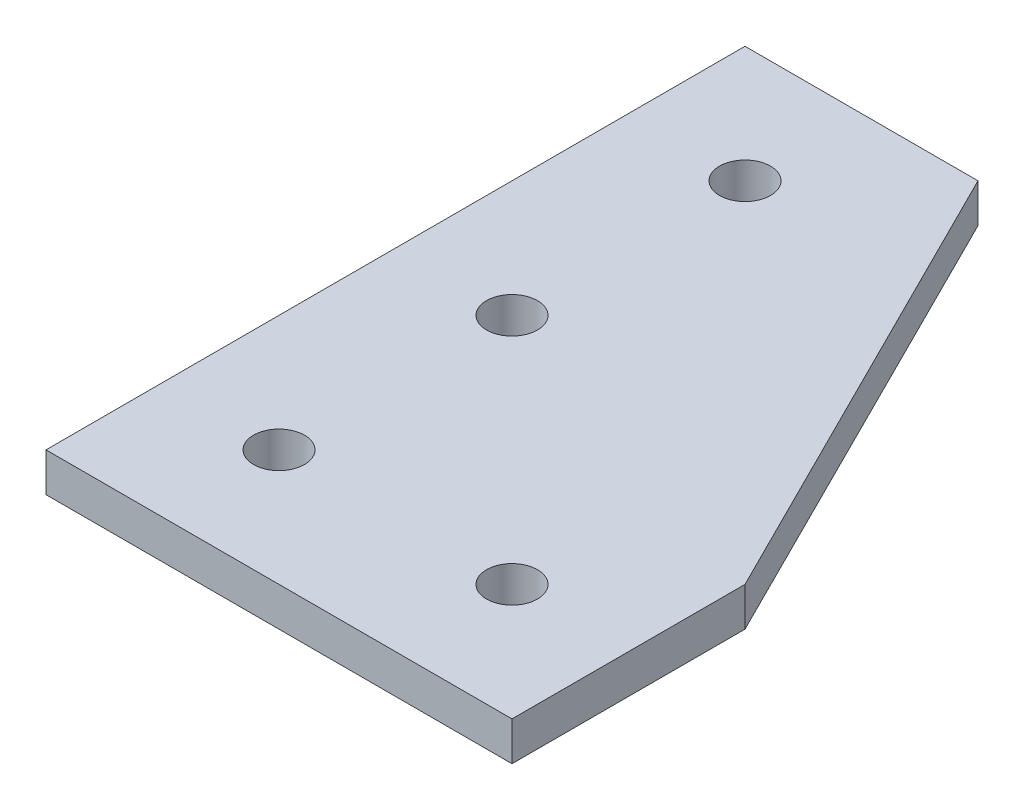
ISO-10303-21;
HEADER;
FILE_DESCRIPTION(('STEP AP214'),'2;1');
FILE_NAME('part.step','',(''),(''),'','','');
FILE_SCHEMA(('AUTOMOTIVE_DESIGN { 1 0 10303 214 1 1 1 1 }'));
ENDSEC;
DATA;
#1=APPLICATION_CONTEXT('core data for automotive mechanical design processes');
#2=APPLICATION_PROTOCOL_DEFINITION('international standard','automotive_design',2000,#1);
#3=PRODUCT_CONTEXT('',#1,'mechanical');
#4=PRODUCT('Part','Part','',(#3));
#5=PRODUCT_RELATED_PRODUCT_CATEGORY('part','',(#4));
#6=PRODUCT_DEFINITION_FORMATION('','',#4);
#7=PRODUCT_DEFINITION_CONTEXT('part definition',#1,'design');
#8=PRODUCT_DEFINITION('design','',#6,#7);
#9=PRODUCT_DEFINITION_SHAPE('','',#8);
#10=(LENGTH_UNIT() NAMED_UNIT(*) SI_UNIT(.MILLI.,.METRE.));
#11=(NAMED_UNIT(*) PLANE_ANGLE_UNIT() SI_UNIT($,.RADIAN.));
#12=(NAMED_UNIT(*) SI_UNIT($,.STERADIAN.) SOLID_ANGLE_UNIT());
#13=UNCERTAINTY_MEASURE_WITH_UNIT(LENGTH_MEASURE(1.E-05),#10,'distance_accuracy_value','');
#14=(GEOMETRIC_REPRESENTATION_CONTEXT(3) GLOBAL_UNCERTAINTY_ASSIGNED_CONTEXT((#13)) GLOBAL_UNIT_ASSIGNED_CONTEXT((#10,
#11,#12)) REPRESENTATION_CONTEXT('',''));
#15=CARTESIAN_POINT('',(0.,0.,0.));
#16=DIRECTION('',(0.,0.,1.));
#17=DIRECTION('',(1.,0.,0.));
#18=AXIS2_PLACEMENT_3D('',#15,#16,#17);
#19=CARTESIAN_POINT('',(38.1,-3.175,57.15));
#20=DIRECTION('',(-1.,0.,0.));
#21=DIRECTION('',(0.,0.,1.));
#22=AXIS2_PLACEMENT_3D('',#19,#20,#21);
#23=PLANE('',#22);
#24=DIRECTION('',(0.,0.,-1.));
#25=VECTOR('',#24,1.);
#26=CARTESIAN_POINT('',(38.1,-3.175,57.15));
#27=LINE('',#26,#25);
#28=CARTESIAN_POINT('',(38.1,-3.175,57.15));
#29=VERTEX_POINT('',#28);
#30=CARTESIAN_POINT('',(38.1,-3.175,19.05));
#31=VERTEX_POINT('',#30);
#32=EDGE_CURVE('E113',#29,#31,#27,.T.);
#33=ORIENTED_EDGE('',*,*,#32,.T.);
#34=DIRECTION('',(0.,1.,0.));
#35=VECTOR('',#34,1.);
#36=CARTESIAN_POINT('',(38.1,-4.445,19.05));
#37=LINE('',#36,#35);
#38=CARTESIAN_POINT('',(38.1,3.175,19.05));
#39=VERTEX_POINT('',#38);
#40=EDGE_CURVE('E100',#31,#39,#37,.T.);
#41=ORIENTED_EDGE('',*,*,#40,.T.);
#42=DIRECTION('',(0.,0.,-1.));
#43=VECTOR('',#42,1.);
#44=CARTESIAN_POINT('',(38.1,3.175,57.15));
#45=LINE('',#44,#43);
#46=CARTESIAN_POINT('',(38.1,3.175,57.15));
#47=VERTEX_POINT('',#46);
#48=EDGE_CURVE('E43',#47,#39,#45,.T.);
#49=ORIENTED_EDGE('',*,*,#48,.F.);
#50=DIRECTION('',(0.,1.,0.));
#51=VECTOR('',#50,1.);
#52=CARTESIAN_POINT('',(38.1,-3.175,57.15));
#53=LINE('',#52,#51);
#54=EDGE_CURVE('E112',#29,#47,#53,.T.);
#55=ORIENTED_EDGE('',*,*,#54,.F.);
#56=EDGE_LOOP('',(#33,#41,#49,#55));
#57=FACE_BOUND('',#56,.T.);
#58=ADVANCED_FACE('F36',(#57),#23,.F.);
#59=CARTESIAN_POINT('',(-38.1,3.175,57.15));
#60=DIRECTION('',(0.,-1.,0.));
#61=DIRECTION('',(0.,0.,-1.));
#62=AXIS2_PLACEMENT_3D('',#59,#60,#61);
#63=PLANE('',#62);
#64=CARTESIAN_POINT('',(-19.05,3.175,-38.1));
#65=DIRECTION('',(0.,1.,0.));
#66=DIRECTION('',(0.,0.,1.));
#67=AXIS2_PLACEMENT_3D('',#64,#65,#66);
#68=CIRCLE('',#67,4.167251);
#69=CARTESIAN_POINT('',(-19.05,3.175,-33.932749));
#70=VERTEX_POINT('',#69);
#71=EDGE_CURVE('E146',#70,#70,#68,.T.);
#72=ORIENTED_EDGE('',*,*,#71,.F.);
#73=EDGE_LOOP('',(#72));
#74=FACE_BOUND('',#73,.T.);
#75=CARTESIAN_POINT('',(-19.05,3.175,0.));
#76=DIRECTION('',(0.,1.,0.));
#77=DIRECTION('',(0.,0.,1.));
#78=AXIS2_PLACEMENT_3D('',#75,#76,#77);
#79=CIRCLE('',#78,4.167251);
#80=CARTESIAN_POINT('',(-19.05,3.175,4.16725099999999));
#81=VERTEX_POINT('',#80);
#82=EDGE_CURVE('E140',#81,#81,#79,.T.);
#83=ORIENTED_EDGE('',*,*,#82,.F.);
#84=EDGE_LOOP('',(#83));
#85=FACE_BOUND('',#84,.T.);
#86=CARTESIAN_POINT('',(19.05,3.175,38.1));
#87=DIRECTION('',(0.,1.,0.));
#88=DIRECTION('',(0.,0.,1.));
#89=AXIS2_PLACEMENT_3D('',#86,#87,#88);
#90=CIRCLE('',#89,4.167251);
#91=CARTESIAN_POINT('',(19.05,3.175,42.267251));
#92=VERTEX_POINT('',#91);
#93=EDGE_CURVE('E134',#92,#92,#90,.T.);
#94=ORIENTED_EDGE('',*,*,#93,.F.);
#95=EDGE_LOOP('',(#94));
#96=FACE_BOUND('',#95,.T.);
#97=CARTESIAN_POINT('',(-19.05,3.175,38.1));
#98=DIRECTION('',(0.,1.,0.));
#99=DIRECTION('',(0.,0.,1.));
#100=AXIS2_PLACEMENT_3D('',#97,#98,#99);
#101=CIRCLE('',#100,4.167251);
#102=CARTESIAN_POINT('',(-19.05,3.175,42.267251));
#103=VERTEX_POINT('',#102);
#104=EDGE_CURVE('E128',#103,#103,#101,.T.);
#105=ORIENTED_EDGE('',*,*,#104,.F.);
#106=EDGE_LOOP('',(#105));
#107=FACE_BOUND('',#106,.T.);
#108=ORIENTED_EDGE('',*,*,#48,.T.);
#109=DIRECTION('',(0.447213595499958,0.,0.894427190999916));
#110=VECTOR('',#109,1.);
#111=CARTESIAN_POINT('',(0.,3.175,-57.15));
#112=LINE('',#111,#110);
#113=CARTESIAN_POINT('',(0.,3.175,-57.15));
#114=VERTEX_POINT('',#113);
#115=EDGE_CURVE('E91',#114,#39,#112,.T.);
#116=ORIENTED_EDGE('',*,*,#115,.F.);
#117=DIRECTION('',(-1.,0.,0.));
#118=VECTOR('',#117,1.);
#119=CARTESIAN_POINT('',(-38.1,3.175,-57.15));
#120=LINE('',#119,#118);
#121=CARTESIAN_POINT('',(-38.1,3.175,-57.15));
#122=VERTEX_POINT('',#121);
#123=EDGE_CURVE('E98',#114,#122,#120,.T.);
#124=ORIENTED_EDGE('',*,*,#123,.T.);
#125=DIRECTION('',(0.,0.,-1.));
#126=VECTOR('',#125,1.);
#127=CARTESIAN_POINT('',(-38.1,3.175,57.15));
#128=LINE('',#127,#126);
#129=CARTESIAN_POINT('',(-38.1,3.175,57.15));
#130=VERTEX_POINT('',#129);
#131=EDGE_CURVE('E118',#130,#122,#128,.T.);
#132=ORIENTED_EDGE('',*,*,#131,.F.);
#133=DIRECTION('',(-1.,0.,0.));
#134=VECTOR('',#133,1.);
#135=CARTESIAN_POINT('',(-38.1,3.175,57.15));
#136=LINE('',#135,#134);
#137=EDGE_CURVE('E82',#47,#130,#136,.T.);
#138=ORIENTED_EDGE('',*,*,#137,.F.);
#139=EDGE_LOOP('',(#108,#116,#124,#132,#138));
#140=FACE_BOUND('',#139,.T.);
#141=ADVANCED_FACE('F97',(#74,#85,#96,#107,#140),#63,.F.);
#142=CARTESIAN_POINT('',(-38.1,-3.175,57.15));
#143=DIRECTION('',(1.,0.,0.));
#144=DIRECTION('',(0.,0.,-1.));
#145=AXIS2_PLACEMENT_3D('',#142,#143,#144);
#146=PLANE('',#145);
#147=DIRECTION('',(0.,-1.,0.));
#148=VECTOR('',#147,1.);
#149=CARTESIAN_POINT('',(-38.1,-3.175,-57.15));
#150=LINE('',#149,#148);
#151=CARTESIAN_POINT('',(-38.1,-3.175,-57.15));
#152=VERTEX_POINT('',#151);
#153=EDGE_CURVE('E74',#122,#152,#150,.T.);
#154=ORIENTED_EDGE('',*,*,#153,.T.);
#155=DIRECTION('',(0.,0.,-1.));
#156=VECTOR('',#155,1.);
#157=CARTESIAN_POINT('',(-38.1,-3.175,57.15));
#158=LINE('',#157,#156);
#159=CARTESIAN_POINT('',(-38.1,-3.175,57.15));
#160=VERTEX_POINT('',#159);
#161=EDGE_CURVE('E116',#160,#152,#158,.T.);
#162=ORIENTED_EDGE('',*,*,#161,.F.);
#163=DIRECTION('',(0.,-1.,0.));
#164=VECTOR('',#163,1.);
#165=CARTESIAN_POINT('',(-38.1,-3.175,57.15));
#166=LINE('',#165,#164);
#167=EDGE_CURVE('E121',#130,#160,#166,.T.);
#168=ORIENTED_EDGE('',*,*,#167,.F.);
#169=ORIENTED_EDGE('',*,*,#131,.T.);
#170=EDGE_LOOP('',(#154,#162,#168,#169));
#171=FACE_BOUND('',#170,.T.);
#172=ADVANCED_FACE('F120',(#171),#146,.F.);
#173=CARTESIAN_POINT('',(-38.1,-3.175,57.15));
#174=DIRECTION('',(0.,1.,0.));
#175=DIRECTION('',(0.,0.,1.));
#176=AXIS2_PLACEMENT_3D('',#173,#174,#175);
#177=PLANE('',#176);
#178=CARTESIAN_POINT('',(-19.05,-3.175,-38.1));
#179=DIRECTION('',(0.,1.,0.));
#180=DIRECTION('',(0.,0.,1.));
#181=AXIS2_PLACEMENT_3D('',#178,#179,#180);
#182=CIRCLE('',#181,4.167251);
#183=CARTESIAN_POINT('',(-19.05,-3.175,-33.932749));
#184=VERTEX_POINT('',#183);
#185=EDGE_CURVE('E143',#184,#184,#182,.T.);
#186=ORIENTED_EDGE('',*,*,#185,.T.);
#187=EDGE_LOOP('',(#186));
#188=FACE_BOUND('',#187,.T.);
#189=CARTESIAN_POINT('',(-19.05,-3.175,0.));
#190=DIRECTION('',(0.,1.,0.));
#191=DIRECTION('',(0.,0.,1.));
#192=AXIS2_PLACEMENT_3D('',#189,#190,#191);
#193=CIRCLE('',#192,4.167251);
#194=CARTESIAN_POINT('',(-19.05,-3.175,4.16725099999999));
#195=VERTEX_POINT('',#194);
#196=EDGE_CURVE('E137',#195,#195,#193,.T.);
#197=ORIENTED_EDGE('',*,*,#196,.T.);
#198=EDGE_LOOP('',(#197));
#199=FACE_BOUND('',#198,.T.);
#200=CARTESIAN_POINT('',(19.05,-3.175,38.1));
#201=DIRECTION('',(0.,1.,0.));
#202=DIRECTION('',(0.,0.,1.));
#203=AXIS2_PLACEMENT_3D('',#200,#201,#202);
#204=CIRCLE('',#203,4.167251);
#205=CARTESIAN_POINT('',(19.05,-3.175,42.267251));
#206=VERTEX_POINT('',#205);
#207=EDGE_CURVE('E131',#206,#206,#204,.T.);
#208=ORIENTED_EDGE('',*,*,#207,.T.);
#209=EDGE_LOOP('',(#208));
#210=FACE_BOUND('',#209,.T.);
#211=CARTESIAN_POINT('',(-19.05,-3.175,38.1));
#212=DIRECTION('',(0.,1.,0.));
#213=DIRECTION('',(0.,0.,1.));
#214=AXIS2_PLACEMENT_3D('',#211,#212,#213);
#215=CIRCLE('',#214,4.167251);
#216=CARTESIAN_POINT('',(-19.05,-3.175,42.267251));
#217=VERTEX_POINT('',#216);
#218=EDGE_CURVE('E101',#217,#217,#215,.T.);
#219=ORIENTED_EDGE('',*,*,#218,.T.);
#220=EDGE_LOOP('',(#219));
#221=FACE_BOUND('',#220,.T.);
#222=DIRECTION('',(1.,0.,0.));
#223=VECTOR('',#222,1.);
#224=CARTESIAN_POINT('',(-38.1,-3.175,-57.15));
#225=LINE('',#224,#223);
#226=CARTESIAN_POINT('',(0.,-3.175,-57.15));
#227=VERTEX_POINT('',#226);
#228=EDGE_CURVE('E105',#152,#227,#225,.T.);
#229=ORIENTED_EDGE('',*,*,#228,.T.);
#230=DIRECTION('',(0.447213595499958,0.,0.894427190999916));
#231=VECTOR('',#230,1.);
#232=CARTESIAN_POINT('',(38.1,-3.175,19.05));
#233=LINE('',#232,#231);
#234=EDGE_CURVE('E49',#227,#31,#233,.T.);
#235=ORIENTED_EDGE('',*,*,#234,.T.);
#236=ORIENTED_EDGE('',*,*,#32,.F.);
#237=DIRECTION('',(1.,0.,0.));
#238=VECTOR('',#237,1.);
#239=CARTESIAN_POINT('',(-38.1,-3.175,57.15));
#240=LINE('',#239,#238);
#241=EDGE_CURVE('E58',#160,#29,#240,.T.);
#242=ORIENTED_EDGE('',*,*,#241,.F.);
#243=ORIENTED_EDGE('',*,*,#161,.T.);
#244=EDGE_LOOP('',(#229,#235,#236,#242,#243));
#245=FACE_BOUND('',#244,.T.);
#246=ADVANCED_FACE('F180',(#188,#199,#210,#221,#245),#177,.F.);
#247=CARTESIAN_POINT('',(38.1,3.175,57.15));
#248=DIRECTION('',(0.,0.,-1.));
#249=DIRECTION('',(-1.,0.,0.));
#250=AXIS2_PLACEMENT_3D('',#247,#248,#249);
#251=PLANE('',#250);
#252=ORIENTED_EDGE('',*,*,#54,.T.);
#253=ORIENTED_EDGE('',*,*,#137,.T.);
#254=ORIENTED_EDGE('',*,*,#167,.T.);
#255=ORIENTED_EDGE('',*,*,#241,.T.);
#256=EDGE_LOOP('',(#252,#253,#254,#255));
#257=FACE_BOUND('',#256,.T.);
#258=ADVANCED_FACE('F182',(#257),#251,.F.);
#259=CARTESIAN_POINT('',(38.1,3.175,-57.15));
#260=DIRECTION('',(0.,0.,-1.));
#261=DIRECTION('',(-1.,0.,0.));
#262=AXIS2_PLACEMENT_3D('',#259,#260,#261);
#263=PLANE('',#262);
#264=DIRECTION('',(0.,1.,0.));
#265=VECTOR('',#264,1.);
#266=CARTESIAN_POINT('',(0.,3.175,-57.15));
#267=LINE('',#266,#265);
#268=EDGE_CURVE('E11',#227,#114,#267,.T.);
#269=ORIENTED_EDGE('',*,*,#268,.F.);
#270=ORIENTED_EDGE('',*,*,#228,.F.);
#271=ORIENTED_EDGE('',*,*,#153,.F.);
#272=ORIENTED_EDGE('',*,*,#123,.F.);
#273=EDGE_LOOP('',(#269,#270,#271,#272));
#274=FACE_BOUND('',#273,.T.);
#275=ADVANCED_FACE('F103',(#274),#263,.T.);
#276=CARTESIAN_POINT('',(0.,-4.445,-57.15));
#277=DIRECTION('',(-0.894427190999916,0.,0.447213595499958));
#278=DIRECTION('',(0.447213595499958,0.,0.894427190999916));
#279=AXIS2_PLACEMENT_3D('',#276,#277,#278);
#280=PLANE('',#279);
#281=ORIENTED_EDGE('',*,*,#268,.T.);
#282=ORIENTED_EDGE('',*,*,#115,.T.);
#283=ORIENTED_EDGE('',*,*,#40,.F.);
#284=ORIENTED_EDGE('',*,*,#234,.F.);
#285=EDGE_LOOP('',(#281,#282,#283,#284));
#286=FACE_BOUND('',#285,.T.);
#287=ADVANCED_FACE('F90',(#286),#280,.F.);
#288=CARTESIAN_POINT('',(-19.05,3.175,38.1));
#289=DIRECTION('',(0.,1.,0.));
#290=DIRECTION('',(0.,0.,1.));
#291=AXIS2_PLACEMENT_3D('',#288,#289,#290);
#292=CYLINDRICAL_SURFACE('',#291,4.167251);
#293=ORIENTED_EDGE('',*,*,#218,.F.);
#294=EDGE_LOOP('',(#293));
#295=FACE_BOUND('',#294,.T.);
#296=ORIENTED_EDGE('',*,*,#104,.T.);
#297=EDGE_LOOP('',(#296));
#298=FACE_BOUND('',#297,.T.);
#299=ADVANCED_FACE('F160',(#295,#298),#292,.F.);
#300=CARTESIAN_POINT('',(19.05,3.175,38.1));
#301=DIRECTION('',(0.,1.,0.));
#302=DIRECTION('',(0.,0.,1.));
#303=AXIS2_PLACEMENT_3D('',#300,#301,#302);
#304=CYLINDRICAL_SURFACE('',#303,4.167251);
#305=ORIENTED_EDGE('',*,*,#207,.F.);
#306=EDGE_LOOP('',(#305));
#307=FACE_BOUND('',#306,.T.);
#308=ORIENTED_EDGE('',*,*,#93,.T.);
#309=EDGE_LOOP('',(#308));
#310=FACE_BOUND('',#309,.T.);
#311=ADVANCED_FACE('F162',(#307,#310),#304,.F.);
#312=CARTESIAN_POINT('',(-19.05,3.175,0.));
#313=DIRECTION('',(0.,1.,0.));
#314=DIRECTION('',(0.,0.,1.));
#315=AXIS2_PLACEMENT_3D('',#312,#313,#314);
#316=CYLINDRICAL_SURFACE('',#315,4.167251);
#317=ORIENTED_EDGE('',*,*,#196,.F.);
#318=EDGE_LOOP('',(#317));
#319=FACE_BOUND('',#318,.T.);
#320=ORIENTED_EDGE('',*,*,#82,.T.);
#321=EDGE_LOOP('',(#320));
#322=FACE_BOUND('',#321,.T.);
#323=ADVANCED_FACE('F169',(#319,#322),#316,.F.);
#324=CARTESIAN_POINT('',(-19.05,3.175,-38.1));
#325=DIRECTION('',(0.,1.,0.));
#326=DIRECTION('',(0.,0.,1.));
#327=AXIS2_PLACEMENT_3D('',#324,#325,#326);
#328=CYLINDRICAL_SURFACE('',#327,4.167251);
#329=ORIENTED_EDGE('',*,*,#185,.F.);
#330=EDGE_LOOP('',(#329));
#331=FACE_BOUND('',#330,.T.);
#332=ORIENTED_EDGE('',*,*,#71,.T.);
#333=EDGE_LOOP('',(#332));
#334=FACE_BOUND('',#333,.T.);
#335=ADVANCED_FACE('F150',(#331,#334),#328,.F.);
#336=CLOSED_SHELL('',(#58,#141,#172,#246,#258,#275,#287,#299,#311,#323,#335));
#337=MANIFOLD_SOLID_BREP('B2',#336);
#338=ADVANCED_BREP_SHAPE_REPRESENTATION('',(#18,#337),#14);
#339=SHAPE_DEFINITION_REPRESENTATION(#9,#338);
ENDSEC;
END-ISO-10303-21;
